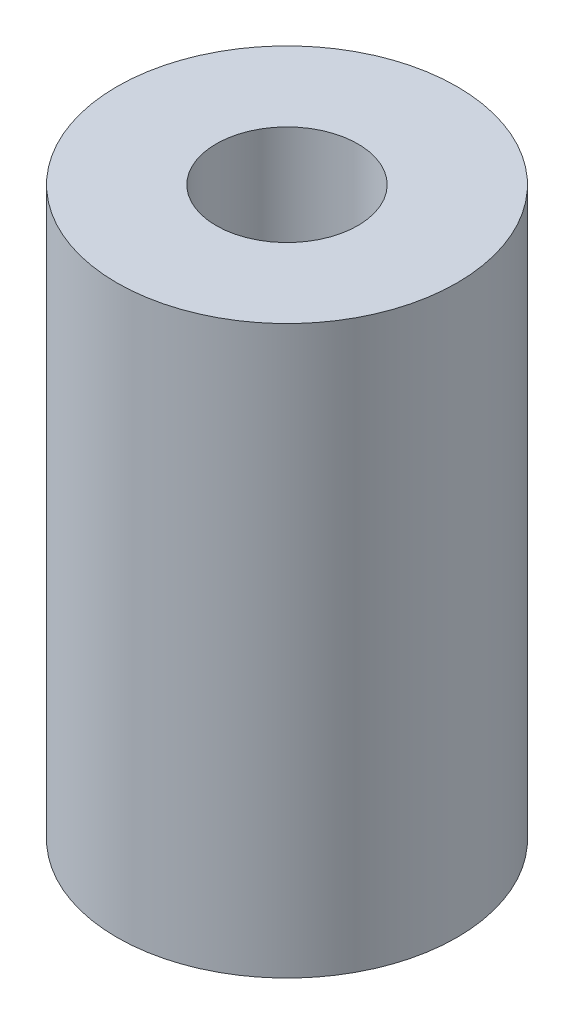
ISO-10303-21;
HEADER;
FILE_DESCRIPTION(('STEP AP214'),'2;1');
FILE_NAME('part.step','',(''),(''),'','','');
FILE_SCHEMA(('AUTOMOTIVE_DESIGN { 1 0 10303 214 1 1 1 1 }'));
ENDSEC;
DATA;
#1=APPLICATION_CONTEXT('core data for automotive mechanical design processes');
#2=APPLICATION_PROTOCOL_DEFINITION('international standard','automotive_design',2000,#1);
#3=PRODUCT_CONTEXT('',#1,'mechanical');
#4=PRODUCT('Part','Part','',(#3));
#5=PRODUCT_RELATED_PRODUCT_CATEGORY('part','',(#4));
#6=PRODUCT_DEFINITION_FORMATION('','',#4);
#7=PRODUCT_DEFINITION_CONTEXT('part definition',#1,'design');
#8=PRODUCT_DEFINITION('design','',#6,#7);
#9=PRODUCT_DEFINITION_SHAPE('','',#8);
#10=(LENGTH_UNIT() NAMED_UNIT(*) SI_UNIT(.MILLI.,.METRE.));
#11=(NAMED_UNIT(*) PLANE_ANGLE_UNIT() SI_UNIT($,.RADIAN.));
#12=(NAMED_UNIT(*) SI_UNIT($,.STERADIAN.) SOLID_ANGLE_UNIT());
#13=UNCERTAINTY_MEASURE_WITH_UNIT(LENGTH_MEASURE(1.E-05),#10,'distance_accuracy_value','');
#14=(GEOMETRIC_REPRESENTATION_CONTEXT(3) GLOBAL_UNCERTAINTY_ASSIGNED_CONTEXT((#13)) GLOBAL_UNIT_ASSIGNED_CONTEXT((#10,
#11,#12)) REPRESENTATION_CONTEXT('',''));
#15=CARTESIAN_POINT('',(0.,0.,0.));
#16=DIRECTION('',(0.,0.,1.));
#17=DIRECTION('',(1.,0.,0.));
#18=AXIS2_PLACEMENT_3D('',#15,#16,#17);
#19=CARTESIAN_POINT('',(0.,20.,0.));
#20=DIRECTION('',(0.,-1.,0.));
#21=DIRECTION('',(0.,0.,-1.));
#22=AXIS2_PLACEMENT_3D('',#19,#20,#21);
#23=CYLINDRICAL_SURFACE('',#22,6.);
#24=CARTESIAN_POINT('',(0.,20.,0.));
#25=DIRECTION('',(0.,1.,0.));
#26=DIRECTION('',(0.,0.,1.));
#27=AXIS2_PLACEMENT_3D('',#24,#25,#26);
#28=CIRCLE('',#27,6.);
#29=CARTESIAN_POINT('',(0.,20.,6.));
#30=VERTEX_POINT('',#29);
#31=EDGE_CURVE('E12',#30,#30,#28,.T.);
#32=ORIENTED_EDGE('',*,*,#31,.F.);
#33=EDGE_LOOP('',(#32));
#34=FACE_BOUND('',#33,.T.);
#35=CARTESIAN_POINT('',(0.,0.,0.));
#36=DIRECTION('',(0.,1.,0.));
#37=DIRECTION('',(0.,0.,1.));
#38=AXIS2_PLACEMENT_3D('',#35,#36,#37);
#39=CIRCLE('',#38,6.);
#40=CARTESIAN_POINT('',(0.,0.,6.));
#41=VERTEX_POINT('',#40);
#42=EDGE_CURVE('E45',#41,#41,#39,.T.);
#43=ORIENTED_EDGE('',*,*,#42,.T.);
#44=EDGE_LOOP('',(#43));
#45=FACE_BOUND('',#44,.T.);
#46=ADVANCED_FACE('F42',(#34,#45),#23,.T.);
#47=CARTESIAN_POINT('',(0.,20.,0.));
#48=DIRECTION('',(0.,1.,0.));
#49=DIRECTION('',(0.,0.,1.));
#50=AXIS2_PLACEMENT_3D('',#47,#48,#49);
#51=PLANE('',#50);
#52=CARTESIAN_POINT('',(0.,20.,0.));
#53=DIRECTION('',(0.,1.,0.));
#54=DIRECTION('',(0.,0.,1.));
#55=AXIS2_PLACEMENT_3D('',#52,#53,#54);
#56=CIRCLE('',#55,2.5);
#57=CARTESIAN_POINT('',(0.,20.,2.5));
#58=VERTEX_POINT('',#57);
#59=EDGE_CURVE('E52',#58,#58,#56,.T.);
#60=ORIENTED_EDGE('',*,*,#59,.F.);
#61=EDGE_LOOP('',(#60));
#62=FACE_BOUND('',#61,.T.);
#63=ORIENTED_EDGE('',*,*,#31,.T.);
#64=EDGE_LOOP('',(#63));
#65=FACE_BOUND('',#64,.T.);
#66=ADVANCED_FACE('F65',(#62,#65),#51,.T.);
#67=CARTESIAN_POINT('',(0.,0.,0.));
#68=DIRECTION('',(0.,1.,0.));
#69=DIRECTION('',(0.,0.,1.));
#70=AXIS2_PLACEMENT_3D('',#67,#68,#69);
#71=PLANE('',#70);
#72=CARTESIAN_POINT('',(0.,0.,0.));
#73=DIRECTION('',(0.,-1.,0.));
#74=DIRECTION('',(0.,0.,-1.));
#75=AXIS2_PLACEMENT_3D('',#72,#73,#74);
#76=CIRCLE('',#75,2.5);
#77=CARTESIAN_POINT('',(0.,0.,-2.5));
#78=VERTEX_POINT('',#77);
#79=EDGE_CURVE('E56',#78,#78,#76,.T.);
#80=ORIENTED_EDGE('',*,*,#79,.F.);
#81=EDGE_LOOP('',(#80));
#82=FACE_BOUND('',#81,.T.);
#83=ORIENTED_EDGE('',*,*,#42,.F.);
#84=EDGE_LOOP('',(#83));
#85=FACE_BOUND('',#84,.T.);
#86=ADVANCED_FACE('F62',(#82,#85),#71,.F.);
#87=CARTESIAN_POINT('',(0.,10.,0.));
#88=DIRECTION('',(0.,1.,0.));
#89=DIRECTION('',(0.,0.,1.));
#90=AXIS2_PLACEMENT_3D('',#87,#88,#89);
#91=CYLINDRICAL_SURFACE('',#90,2.5);
#92=ORIENTED_EDGE('',*,*,#59,.T.);
#93=EDGE_LOOP('',(#92));
#94=FACE_BOUND('',#93,.T.);
#95=ORIENTED_EDGE('',*,*,#79,.T.);
#96=EDGE_LOOP('',(#95));
#97=FACE_BOUND('',#96,.T.);
#98=ADVANCED_FACE('F60',(#94,#97),#91,.F.);
#99=CLOSED_SHELL('',(#46,#66,#86,#98));
#100=MANIFOLD_SOLID_BREP('B2',#99);
#101=ADVANCED_BREP_SHAPE_REPRESENTATION('',(#18,#100),#14);
#102=SHAPE_DEFINITION_REPRESENTATION(#9,#101);
ENDSEC;
END-ISO-10303-21;
